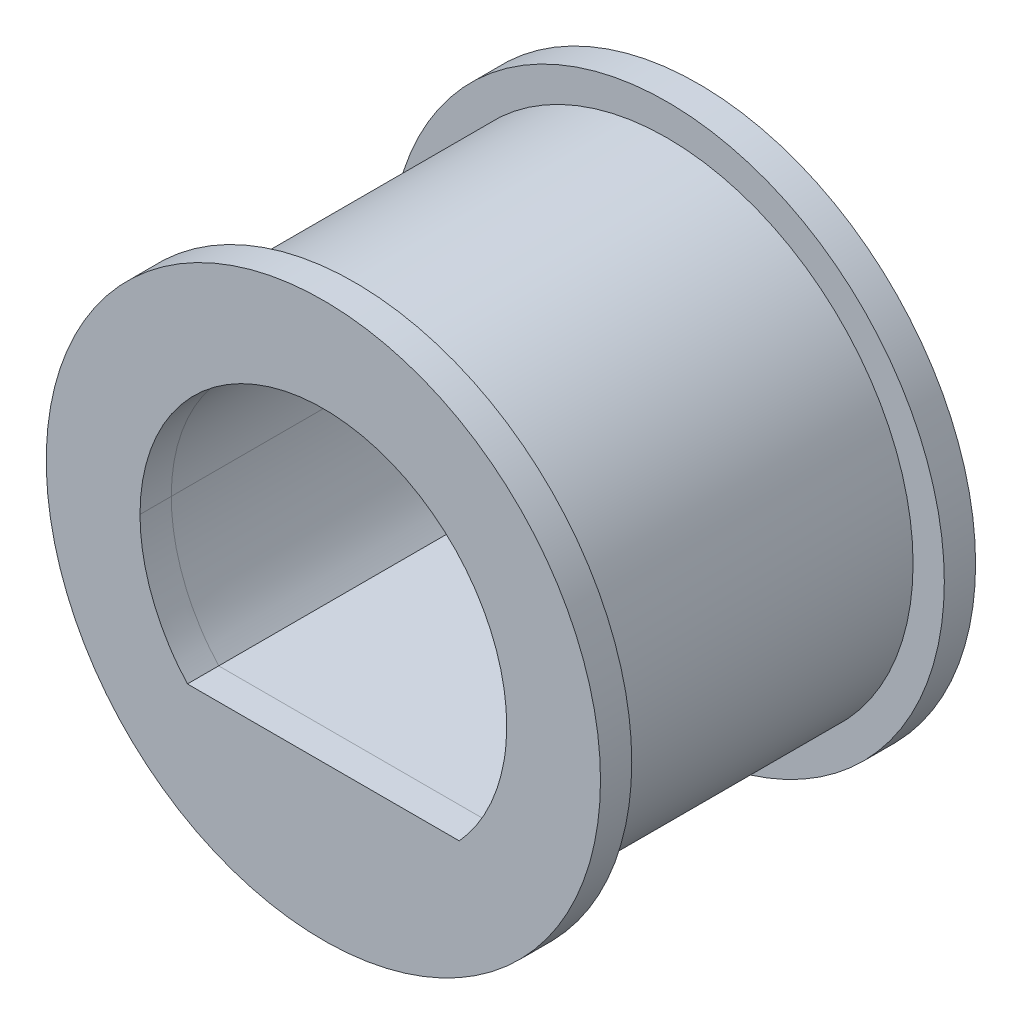
ISO-10303-21;
HEADER;
FILE_DESCRIPTION(('STEP AP214'),'2;1');
FILE_NAME('part.step','',(''),(''),'','','');
FILE_SCHEMA(('AUTOMOTIVE_DESIGN { 1 0 10303 214 1 1 1 1 }'));
ENDSEC;
DATA;
#1=APPLICATION_CONTEXT('core data for automotive mechanical design processes');
#2=APPLICATION_PROTOCOL_DEFINITION('international standard','automotive_design',2000,#1);
#3=PRODUCT_CONTEXT('',#1,'mechanical');
#4=PRODUCT('Part','Part','',(#3));
#5=PRODUCT_RELATED_PRODUCT_CATEGORY('part','',(#4));
#6=PRODUCT_DEFINITION_FORMATION('','',#4);
#7=PRODUCT_DEFINITION_CONTEXT('part definition',#1,'design');
#8=PRODUCT_DEFINITION('design','',#6,#7);
#9=PRODUCT_DEFINITION_SHAPE('','',#8);
#10=(LENGTH_UNIT() NAMED_UNIT(*) SI_UNIT(.MILLI.,.METRE.));
#11=(NAMED_UNIT(*) PLANE_ANGLE_UNIT() SI_UNIT($,.RADIAN.));
#12=(NAMED_UNIT(*) SI_UNIT($,.STERADIAN.) SOLID_ANGLE_UNIT());
#13=UNCERTAINTY_MEASURE_WITH_UNIT(LENGTH_MEASURE(1.E-05),#10,'distance_accuracy_value','');
#14=(GEOMETRIC_REPRESENTATION_CONTEXT(3) GLOBAL_UNCERTAINTY_ASSIGNED_CONTEXT((#13)) GLOBAL_UNIT_ASSIGNED_CONTEXT((#10,
#11,#12)) REPRESENTATION_CONTEXT('',''));
#15=CARTESIAN_POINT('',(0.,0.,0.));
#16=DIRECTION('',(0.,0.,1.));
#17=DIRECTION('',(1.,0.,0.));
#18=AXIS2_PLACEMENT_3D('',#15,#16,#17);
#19=CARTESIAN_POINT('',(-14.5851739919806,6.36139254563578,-1.524));
#20=DIRECTION('',(0.,0.,-1.));
#21=DIRECTION('',(1.,0.,0.));
#22=AXIS2_PLACEMENT_3D('',#19,#20,#21);
#23=PLANE('',#22);
#24=CARTESIAN_POINT('',(-14.5851739919806,6.36139254563578,-1.524));
#25=DIRECTION('',(0.,0.,1.));
#26=DIRECTION('',(1.,0.,0.));
#27=AXIS2_PLACEMENT_3D('',#24,#25,#26);
#28=CIRCLE('',#27,2.25199999921703);
#29=CARTESIAN_POINT('',(-12.3331739927636,6.36139254563578,-1.524));
#30=VERTEX_POINT('',#29);
#31=EDGE_CURVE('E13',#30,#30,#28,.T.);
#32=ORIENTED_EDGE('',*,*,#31,.F.);
#33=EDGE_LOOP('',(#32));
#34=FACE_BOUND('',#33,.T.);
#35=CARTESIAN_POINT('',(-13.4805926232933,5.36139254501032,-1.524));
#36=CARTESIAN_POINT('',(-13.4605394357838,5.38434117095109,-1.524));
#37=CARTESIAN_POINT('',(-13.4204708591206,5.43019516685029,-1.524));
#38=CARTESIAN_POINT('',(-13.3658428414687,5.50351120059409,-1.524));
#39=CARTESIAN_POINT('',(-13.3071543361872,5.59247995033721,-1.524));
#40=CARTESIAN_POINT('',(-13.2480453188042,5.69918428010977,-1.524));
#41=CARTESIAN_POINT('',(-13.1929241765407,5.82478776874763,-1.524));
#42=CARTESIAN_POINT('',(-13.1494392898135,5.95491063640749,-1.524));
#43=CARTESIAN_POINT('',(-13.1184048189158,6.08848749479873,-1.524));
#44=CARTESIAN_POINT('',(-13.0987916792207,6.22435735579674,-1.524));
#45=CARTESIAN_POINT('',(-13.0963798882491,6.3157141490313,-1.524));
#46=CARTESIAN_POINT('',(-13.0951739927636,6.36139254563578,-1.524));
#47=B_SPLINE_CURVE_WITH_KNOTS('',3,(#35,#36,#37,#38,#39,#40,#41,#42,#43,#44,#45,#46),
.UNSPECIFIED.,.F.,.F.,(4,1,1,1,1,1,1,1,1,4),(0.,0.0833979864074417,0.166638775523961,
0.25003676136842,0.375030634223039,0.500024507366998,0.625018380155766,0.750012254396463,
0.875006127233265,1.),.UNSPECIFIED.);
#48=CARTESIAN_POINT('',(-13.4805926232933,5.36139254501032,-1.524));
#49=VERTEX_POINT('',#48);
#50=CARTESIAN_POINT('',(-13.0951739927636,6.36139254563578,-1.524));
#51=VERTEX_POINT('',#50);
#52=EDGE_CURVE('E128',#49,#51,#47,.T.);
#53=ORIENTED_EDGE('',*,*,#52,.T.);
#54=CARTESIAN_POINT('',(-14.5851739919806,6.36139254563578,-1.524));
#55=DIRECTION('',(0.,0.,1.));
#56=DIRECTION('',(1.,0.,0.));
#57=AXIS2_PLACEMENT_3D('',#54,#55,#56);
#58=CIRCLE('',#57,1.48999999921703);
#59=CARTESIAN_POINT('',(-16.0751739911976,6.36139254563578,-1.524));
#60=VERTEX_POINT('',#59);
#61=EDGE_CURVE('E133',#51,#60,#58,.T.);
#62=ORIENTED_EDGE('',*,*,#61,.T.);
#63=CARTESIAN_POINT('',(-16.0751739911976,6.36139254563578,-1.524));
#64=CARTESIAN_POINT('',(-16.0746382538317,6.33092153102337,-1.524));
#65=CARTESIAN_POINT('',(-16.0735677889119,6.27003693665063,-1.524));
#66=CARTESIAN_POINT('',(-16.0648597735471,6.17902247897637,-1.524));
#67=CARTESIAN_POINT('',(-16.0486567402516,6.0736790365428,-1.524));
#68=CARTESIAN_POINT('',(-16.0208623719507,5.95490545737212,-1.524));
#69=CARTESIAN_POINT('',(-15.9774276719287,5.82479779553086,-1.524));
#70=CARTESIAN_POINT('',(-15.9223335293216,5.69914935201207,-1.524));
#71=CARTESIAN_POINT('',(-15.8556914098492,5.57929634493184,-1.524));
#72=CARTESIAN_POINT('',(-15.779043388613,5.46540878983214,-1.524));
#73=CARTESIAN_POINT('',(-15.7195180367,5.39606462667621,-1.524));
#74=CARTESIAN_POINT('',(-15.689755360668,5.36139254501032,-1.524));
#75=B_SPLINE_CURVE_WITH_KNOTS('',3,(#63,#64,#65,#66,#67,#68,#69,#70,#71,#72,#73,#74),
.UNSPECIFIED.,.F.,.F.,(4,1,1,1,1,1,1,1,1,4),(0.,0.083397985699971,0.166638774436386,
0.250036760198587,0.375030634439858,0.5000245072292,0.625018380373733,0.750012253228926,
0.875006126297524,1.),.UNSPECIFIED.);
#76=CARTESIAN_POINT('',(-15.689755360668,5.36139254501032,-1.524));
#77=VERTEX_POINT('',#76);
#78=EDGE_CURVE('E129',#60,#77,#75,.T.);
#79=ORIENTED_EDGE('',*,*,#78,.T.);
#80=DIRECTION('',(1.,0.,0.));
#81=VECTOR('',#80,1.);
#82=CARTESIAN_POINT('',(0.,5.36139254501032,-1.524));
#83=LINE('',#82,#81);
#84=EDGE_CURVE('E115',#77,#49,#83,.T.);
#85=ORIENTED_EDGE('',*,*,#84,.T.);
#86=EDGE_LOOP('',(#53,#62,#79,#85));
#87=FACE_BOUND('',#86,.T.);
#88=ADVANCED_FACE('F72',(#34,#87),#23,.T.);
#89=CARTESIAN_POINT('',(-14.5851739919806,6.36139254563578,-1.27));
#90=DIRECTION('',(0.,0.,-1.));
#91=DIRECTION('',(1.,0.,0.));
#92=AXIS2_PLACEMENT_3D('',#89,#90,#91);
#93=PLANE('',#92);
#94=CARTESIAN_POINT('',(-14.5851739919806,6.36139254563578,-1.27));
#95=DIRECTION('',(0.,0.,1.));
#96=DIRECTION('',(1.,0.,0.));
#97=AXIS2_PLACEMENT_3D('',#94,#95,#96);
#98=CIRCLE('',#97,2.25199999921703);
#99=CARTESIAN_POINT('',(-12.3331739927636,6.36139254563578,-1.27));
#100=VERTEX_POINT('',#99);
#101=EDGE_CURVE('E76',#100,#100,#98,.T.);
#102=ORIENTED_EDGE('',*,*,#101,.T.);
#103=EDGE_LOOP('',(#102));
#104=FACE_BOUND('',#103,.T.);
#105=DIRECTION('',(1.,0.,0.));
#106=VECTOR('',#105,1.);
#107=CARTESIAN_POINT('',(0.,5.36139254501032,-1.27));
#108=LINE('',#107,#106);
#109=CARTESIAN_POINT('',(-15.689755360668,5.36139254501032,-1.27));
#110=VERTEX_POINT('',#109);
#111=CARTESIAN_POINT('',(-13.4805926232933,5.36139254501032,-1.27));
#112=VERTEX_POINT('',#111);
#113=EDGE_CURVE('E118',#110,#112,#108,.T.);
#114=ORIENTED_EDGE('',*,*,#113,.F.);
#115=CARTESIAN_POINT('',(-16.0751739911976,6.36139254563578,-1.27));
#116=CARTESIAN_POINT('',(-16.0746382538317,6.33092153102337,-1.27));
#117=CARTESIAN_POINT('',(-16.0735677889119,6.27003693665063,-1.27));
#118=CARTESIAN_POINT('',(-16.0648597735471,6.17902247897637,-1.27));
#119=CARTESIAN_POINT('',(-16.0486567402516,6.0736790365428,-1.27));
#120=CARTESIAN_POINT('',(-16.0208623719507,5.95490545737212,-1.27));
#121=CARTESIAN_POINT('',(-15.9774276719287,5.82479779553086,-1.27));
#122=CARTESIAN_POINT('',(-15.9223335293216,5.69914935201207,-1.27));
#123=CARTESIAN_POINT('',(-15.8556914098492,5.57929634493184,-1.27));
#124=CARTESIAN_POINT('',(-15.779043388613,5.46540878983214,-1.27));
#125=CARTESIAN_POINT('',(-15.7195180367,5.39606462667621,-1.27));
#126=CARTESIAN_POINT('',(-15.689755360668,5.36139254501032,-1.27));
#127=B_SPLINE_CURVE_WITH_KNOTS('',3,(#115,#116,#117,#118,#119,#120,#121,#122,#123,#124,#125,
#126),.UNSPECIFIED.,.F.,.F.,(4,1,1,1,1,1,1,1,1,4),(0.,0.083397985699971,0.166638774436386,
0.250036760198587,0.375030634439858,0.5000245072292,0.625018380373733,0.750012253228926,
0.875006126297524,1.),.UNSPECIFIED.);
#128=CARTESIAN_POINT('',(-16.0751739911976,6.36139254563578,-1.27));
#129=VERTEX_POINT('',#128);
#130=EDGE_CURVE('E130',#129,#110,#127,.T.);
#131=ORIENTED_EDGE('',*,*,#130,.F.);
#132=CARTESIAN_POINT('',(-14.5851739919806,6.36139254563578,-1.27));
#133=DIRECTION('',(0.,0.,1.));
#134=DIRECTION('',(1.,0.,0.));
#135=AXIS2_PLACEMENT_3D('',#132,#133,#134);
#136=CIRCLE('',#135,1.48999999921703);
#137=CARTESIAN_POINT('',(-13.0951739927636,6.36139254563578,-1.27));
#138=VERTEX_POINT('',#137);
#139=EDGE_CURVE('E167',#138,#129,#136,.T.);
#140=ORIENTED_EDGE('',*,*,#139,.F.);
#141=CARTESIAN_POINT('',(-13.4805926232933,5.36139254501032,-1.27));
#142=CARTESIAN_POINT('',(-13.4605394357838,5.38434117095109,-1.27));
#143=CARTESIAN_POINT('',(-13.4204708591206,5.43019516685029,-1.27));
#144=CARTESIAN_POINT('',(-13.3658428414687,5.50351120059409,-1.27));
#145=CARTESIAN_POINT('',(-13.3071543361872,5.59247995033721,-1.27));
#146=CARTESIAN_POINT('',(-13.2480453188042,5.69918428010977,-1.27));
#147=CARTESIAN_POINT('',(-13.1929241765407,5.82478776874763,-1.27));
#148=CARTESIAN_POINT('',(-13.1494392898135,5.95491063640749,-1.27));
#149=CARTESIAN_POINT('',(-13.1184048189158,6.08848749479873,-1.27));
#150=CARTESIAN_POINT('',(-13.0987916792207,6.22435735579674,-1.27));
#151=CARTESIAN_POINT('',(-13.0963798882491,6.3157141490313,-1.27));
#152=CARTESIAN_POINT('',(-13.0951739927636,6.36139254563578,-1.27));
#153=B_SPLINE_CURVE_WITH_KNOTS('',3,(#141,#142,#143,#144,#145,#146,#147,#148,#149,#150,#151,
#152),.UNSPECIFIED.,.F.,.F.,(4,1,1,1,1,1,1,1,1,4),(0.,0.0833979864074417,0.166638775523961,
0.25003676136842,0.375030634223039,0.500024507366998,0.625018380155766,0.750012254396463,
0.875006127233265,1.),.UNSPECIFIED.);
#154=EDGE_CURVE('E165',#112,#138,#153,.T.);
#155=ORIENTED_EDGE('',*,*,#154,.F.);
#156=EDGE_LOOP('',(#114,#131,#140,#155));
#157=FACE_BOUND('',#156,.T.);
#158=ADVANCED_FACE('F152',(#104,#157),#93,.F.);
#159=CARTESIAN_POINT('',(-14.5851739919806,6.36139254563578,-1.524));
#160=DIRECTION('',(0.,0.,1.));
#161=DIRECTION('',(-1.,0.,0.));
#162=AXIS2_PLACEMENT_3D('',#159,#160,#161);
#163=CYLINDRICAL_SURFACE('',#162,2.25199999921703);
#164=ORIENTED_EDGE('',*,*,#31,.T.);
#165=EDGE_LOOP('',(#164));
#166=FACE_BOUND('',#165,.T.);
#167=ORIENTED_EDGE('',*,*,#101,.F.);
#168=EDGE_LOOP('',(#167));
#169=FACE_BOUND('',#168,.T.);
#170=ADVANCED_FACE('F74',(#166,#169),#163,.T.);
#171=CARTESIAN_POINT('',(0.,5.36139254501032,-1.524));
#172=DIRECTION('',(0.,1.,0.));
#173=DIRECTION('',(0.,0.,-1.));
#174=AXIS2_PLACEMENT_3D('',#171,#172,#173);
#175=PLANE('',#174);
#176=ORIENTED_EDGE('',*,*,#113,.T.);
#177=DIRECTION('',(0.,0.,1.));
#178=VECTOR('',#177,1.);
#179=CARTESIAN_POINT('',(-13.4805926232933,5.36139254501032,-1.524));
#180=LINE('',#179,#178);
#181=EDGE_CURVE('E112',#49,#112,#180,.T.);
#182=ORIENTED_EDGE('',*,*,#181,.F.);
#183=ORIENTED_EDGE('',*,*,#84,.F.);
#184=DIRECTION('',(0.,0.,1.));
#185=VECTOR('',#184,1.);
#186=CARTESIAN_POINT('',(-15.689755360668,5.36139254501032,-1.524));
#187=LINE('',#186,#185);
#188=EDGE_CURVE('E95',#77,#110,#187,.T.);
#189=ORIENTED_EDGE('',*,*,#188,.T.);
#190=EDGE_LOOP('',(#176,#182,#183,#189));
#191=FACE_BOUND('',#190,.T.);
#192=ADVANCED_FACE('F114',(#191),#175,.T.);
#193=DIRECTION('',(0.,0.,1.));
#194=VECTOR('',#193,1.);
#195=SURFACE_OF_LINEAR_EXTRUSION('',#47,#194);
#196=ORIENTED_EDGE('',*,*,#154,.T.);
#197=DIRECTION('',(0.,0.,1.));
#198=VECTOR('',#197,1.);
#199=CARTESIAN_POINT('',(-13.0951739927636,6.36139254563578,-1.524));
#200=LINE('',#199,#198);
#201=EDGE_CURVE('E123',#51,#138,#200,.T.);
#202=ORIENTED_EDGE('',*,*,#201,.F.);
#203=ORIENTED_EDGE('',*,*,#52,.F.);
#204=ORIENTED_EDGE('',*,*,#181,.T.);
#205=EDGE_LOOP('',(#196,#202,#203,#204));
#206=FACE_BOUND('',#205,.T.);
#207=ADVANCED_FACE('F132',(#206),#195,.F.);
#208=CARTESIAN_POINT('',(-14.5851739919806,6.36139254563578,-1.524));
#209=DIRECTION('',(0.,0.,1.));
#210=DIRECTION('',(-1.,0.,0.));
#211=AXIS2_PLACEMENT_3D('',#208,#209,#210);
#212=CYLINDRICAL_SURFACE('',#211,1.48999999921703);
#213=ORIENTED_EDGE('',*,*,#139,.T.);
#214=DIRECTION('',(0.,0.,1.));
#215=VECTOR('',#214,1.);
#216=CARTESIAN_POINT('',(-16.0751739911976,6.36139254563578,-1.524));
#217=LINE('',#216,#215);
#218=EDGE_CURVE('E87',#60,#129,#217,.T.);
#219=ORIENTED_EDGE('',*,*,#218,.F.);
#220=ORIENTED_EDGE('',*,*,#61,.F.);
#221=ORIENTED_EDGE('',*,*,#201,.T.);
#222=EDGE_LOOP('',(#213,#219,#220,#221));
#223=FACE_BOUND('',#222,.T.);
#224=ADVANCED_FACE('F147',(#223),#212,.F.);
#225=DIRECTION('',(0.,0.,1.));
#226=VECTOR('',#225,1.);
#227=SURFACE_OF_LINEAR_EXTRUSION('',#75,#226);
#228=ORIENTED_EDGE('',*,*,#130,.T.);
#229=ORIENTED_EDGE('',*,*,#188,.F.);
#230=ORIENTED_EDGE('',*,*,#78,.F.);
#231=ORIENTED_EDGE('',*,*,#218,.T.);
#232=EDGE_LOOP('',(#228,#229,#230,#231));
#233=FACE_BOUND('',#232,.T.);
#234=ADVANCED_FACE('F188',(#233),#227,.F.);
#235=CLOSED_SHELL('',(#88,#158,#170,#192,#207,#224,#234));
#236=MANIFOLD_SOLID_BREP('B2',#235);
#237=CARTESIAN_POINT('',(-14.5851739919806,6.36139254563578,1.524));
#238=DIRECTION('',(0.,0.,1.));
#239=DIRECTION('',(1.,0.,0.));
#240=AXIS2_PLACEMENT_3D('',#237,#238,#239);
#241=PLANE('',#240);
#242=CARTESIAN_POINT('',(-14.5851739919806,6.36139254563578,1.524));
#243=DIRECTION('',(0.,0.,1.));
#244=DIRECTION('',(1.,0.,0.));
#245=AXIS2_PLACEMENT_3D('',#242,#243,#244);
#246=CIRCLE('',#245,2.25199999921703);
#247=CARTESIAN_POINT('',(-12.3331739927636,6.36139254563578,1.524));
#248=VERTEX_POINT('',#247);
#249=EDGE_CURVE('E70',#248,#248,#246,.T.);
#250=ORIENTED_EDGE('',*,*,#249,.T.);
#251=EDGE_LOOP('',(#250));
#252=FACE_BOUND('',#251,.T.);
#253=CARTESIAN_POINT('',(-13.4805926232933,5.36139254501032,1.524));
#254=CARTESIAN_POINT('',(-13.4605394357838,5.38434117095109,1.524));
#255=CARTESIAN_POINT('',(-13.4204708591206,5.43019516685029,1.524));
#256=CARTESIAN_POINT('',(-13.3658428414687,5.50351120059409,1.524));
#257=CARTESIAN_POINT('',(-13.3071543361872,5.59247995033721,1.524));
#258=CARTESIAN_POINT('',(-13.2480453188042,5.69918428010977,1.524));
#259=CARTESIAN_POINT('',(-13.1929241765407,5.82478776874763,1.524));
#260=CARTESIAN_POINT('',(-13.1494392898135,5.95491063640749,1.524));
#261=CARTESIAN_POINT('',(-13.1184048189158,6.08848749479873,1.524));
#262=CARTESIAN_POINT('',(-13.0987916792207,6.22435735579674,1.524));
#263=CARTESIAN_POINT('',(-13.0963798882491,6.3157141490313,1.524));
#264=CARTESIAN_POINT('',(-13.0951739927636,6.36139254563578,1.524));
#265=B_SPLINE_CURVE_WITH_KNOTS('',3,(#253,#254,#255,#256,#257,#258,#259,#260,#261,#262,#263,
#264),.UNSPECIFIED.,.F.,.F.,(4,1,1,1,1,1,1,1,1,4),(0.,0.0833979864074417,0.166638775523961,
0.25003676136842,0.375030634223039,0.500024507366998,0.625018380155766,0.750012254396463,
0.875006127233265,1.),.UNSPECIFIED.);
#266=CARTESIAN_POINT('',(-13.4805926232933,5.36139254501032,1.524));
#267=VERTEX_POINT('',#266);
#268=CARTESIAN_POINT('',(-13.0951739927636,6.36139254563578,1.524));
#269=VERTEX_POINT('',#268);
#270=EDGE_CURVE('E302',#267,#269,#265,.T.);
#271=ORIENTED_EDGE('',*,*,#270,.F.);
#272=DIRECTION('',(1.,0.,0.));
#273=VECTOR('',#272,1.);
#274=CARTESIAN_POINT('',(0.,5.36139254501032,1.524));
#275=LINE('',#274,#273);
#276=CARTESIAN_POINT('',(-15.689755360668,5.36139254501032,1.524));
#277=VERTEX_POINT('',#276);
#278=EDGE_CURVE('E294',#277,#267,#275,.T.);
#279=ORIENTED_EDGE('',*,*,#278,.F.);
#280=CARTESIAN_POINT('',(-16.0751739911976,6.36139254563578,1.524));
#281=CARTESIAN_POINT('',(-16.0746382538317,6.33092153102337,1.524));
#282=CARTESIAN_POINT('',(-16.0735677889119,6.27003693665063,1.524));
#283=CARTESIAN_POINT('',(-16.0648597735471,6.17902247897637,1.524));
#284=CARTESIAN_POINT('',(-16.0486567402516,6.0736790365428,1.524));
#285=CARTESIAN_POINT('',(-16.0208623719507,5.95490545737212,1.524));
#286=CARTESIAN_POINT('',(-15.9774276719287,5.82479779553086,1.524));
#287=CARTESIAN_POINT('',(-15.9223335293216,5.69914935201207,1.524));
#288=CARTESIAN_POINT('',(-15.8556914098492,5.57929634493184,1.524));
#289=CARTESIAN_POINT('',(-15.779043388613,5.46540878983214,1.524));
#290=CARTESIAN_POINT('',(-15.7195180367,5.39606462667621,1.524));
#291=CARTESIAN_POINT('',(-15.689755360668,5.36139254501032,1.524));
#292=B_SPLINE_CURVE_WITH_KNOTS('',3,(#280,#281,#282,#283,#284,#285,#286,#287,#288,#289,#290,
#291),.UNSPECIFIED.,.F.,.F.,(4,1,1,1,1,1,1,1,1,4),(0.,0.083397985699971,0.166638774436386,
0.250036760198587,0.375030634439858,0.5000245072292,0.625018380373733,0.750012253228926,
0.875006126297524,1.),.UNSPECIFIED.);
#293=CARTESIAN_POINT('',(-16.0751739911976,6.36139254563578,1.524));
#294=VERTEX_POINT('',#293);
#295=EDGE_CURVE('E315',#294,#277,#292,.T.);
#296=ORIENTED_EDGE('',*,*,#295,.F.);
#297=CARTESIAN_POINT('',(-14.5851739919806,6.36139254563578,1.524));
#298=DIRECTION('',(0.,0.,1.));
#299=DIRECTION('',(1.,0.,0.));
#300=AXIS2_PLACEMENT_3D('',#297,#298,#299);
#301=CIRCLE('',#300,1.48999999921703);
#302=EDGE_CURVE('E313',#269,#294,#301,.T.);
#303=ORIENTED_EDGE('',*,*,#302,.F.);
#304=EDGE_LOOP('',(#271,#279,#296,#303));
#305=FACE_BOUND('',#304,.T.);
#306=ADVANCED_FACE('F253',(#252,#305),#241,.T.);
#307=CARTESIAN_POINT('',(-14.5851739919806,6.36139254563578,1.27));
#308=DIRECTION('',(0.,0.,1.));
#309=DIRECTION('',(1.,0.,0.));
#310=AXIS2_PLACEMENT_3D('',#307,#308,#309);
#311=PLANE('',#310);
#312=CARTESIAN_POINT('',(-14.5851739919806,6.36139254563578,1.27));
#313=DIRECTION('',(0.,0.,1.));
#314=DIRECTION('',(1.,0.,0.));
#315=AXIS2_PLACEMENT_3D('',#312,#313,#314);
#316=CIRCLE('',#315,2.25199999921703);
#317=CARTESIAN_POINT('',(-12.3331739927636,6.36139254563578,1.27));
#318=VERTEX_POINT('',#317);
#319=EDGE_CURVE('E257',#318,#318,#316,.T.);
#320=ORIENTED_EDGE('',*,*,#319,.F.);
#321=EDGE_LOOP('',(#320));
#322=FACE_BOUND('',#321,.T.);
#323=DIRECTION('',(1.,0.,0.));
#324=VECTOR('',#323,1.);
#325=CARTESIAN_POINT('',(0.,5.36139254501032,1.27));
#326=LINE('',#325,#324);
#327=CARTESIAN_POINT('',(-15.689755360668,5.36139254501032,1.27));
#328=VERTEX_POINT('',#327);
#329=CARTESIAN_POINT('',(-13.4805926232933,5.36139254501032,1.27));
#330=VERTEX_POINT('',#329);
#331=EDGE_CURVE('E276',#328,#330,#326,.T.);
#332=ORIENTED_EDGE('',*,*,#331,.T.);
#333=CARTESIAN_POINT('',(-13.4805926232933,5.36139254501032,1.27));
#334=CARTESIAN_POINT('',(-13.4605394357838,5.38434117095109,1.27));
#335=CARTESIAN_POINT('',(-13.4204708591206,5.43019516685029,1.27));
#336=CARTESIAN_POINT('',(-13.3658428414687,5.50351120059409,1.27));
#337=CARTESIAN_POINT('',(-13.3071543361872,5.59247995033721,1.27));
#338=CARTESIAN_POINT('',(-13.2480453188042,5.69918428010977,1.27));
#339=CARTESIAN_POINT('',(-13.1929241765407,5.82478776874763,1.27));
#340=CARTESIAN_POINT('',(-13.1494392898135,5.95491063640749,1.27));
#341=CARTESIAN_POINT('',(-13.1184048189158,6.08848749479873,1.27));
#342=CARTESIAN_POINT('',(-13.0987916792207,6.22435735579674,1.27));
#343=CARTESIAN_POINT('',(-13.0963798882491,6.3157141490313,1.27));
#344=CARTESIAN_POINT('',(-13.0951739927636,6.36139254563578,1.27));
#345=B_SPLINE_CURVE_WITH_KNOTS('',3,(#333,#334,#335,#336,#337,#338,#339,#340,#341,#342,#343,
#344),.UNSPECIFIED.,.F.,.F.,(4,1,1,1,1,1,1,1,1,4),(0.,0.0833979864074417,0.166638775523961,
0.25003676136842,0.375030634223039,0.500024507366998,0.625018380155766,0.750012254396463,
0.875006127233265,1.),.UNSPECIFIED.);
#346=CARTESIAN_POINT('',(-13.0951739927636,6.36139254563578,1.27));
#347=VERTEX_POINT('',#346);
#348=EDGE_CURVE('E309',#330,#347,#345,.T.);
#349=ORIENTED_EDGE('',*,*,#348,.T.);
#350=CARTESIAN_POINT('',(-14.5851739919806,6.36139254563578,1.27));
#351=DIRECTION('',(0.,0.,1.));
#352=DIRECTION('',(1.,0.,0.));
#353=AXIS2_PLACEMENT_3D('',#350,#351,#352);
#354=CIRCLE('',#353,1.48999999921703);
#355=CARTESIAN_POINT('',(-16.0751739911976,6.36139254563578,1.27));
#356=VERTEX_POINT('',#355);
#357=EDGE_CURVE('E347',#347,#356,#354,.T.);
#358=ORIENTED_EDGE('',*,*,#357,.T.);
#359=CARTESIAN_POINT('',(-16.0751739911976,6.36139254563578,1.27));
#360=CARTESIAN_POINT('',(-16.0746382538317,6.33092153102337,1.27));
#361=CARTESIAN_POINT('',(-16.0735677889119,6.27003693665063,1.27));
#362=CARTESIAN_POINT('',(-16.0648597735471,6.17902247897637,1.27));
#363=CARTESIAN_POINT('',(-16.0486567402516,6.0736790365428,1.27));
#364=CARTESIAN_POINT('',(-16.0208623719507,5.95490545737212,1.27));
#365=CARTESIAN_POINT('',(-15.9774276719287,5.82479779553086,1.27));
#366=CARTESIAN_POINT('',(-15.9223335293216,5.69914935201207,1.27));
#367=CARTESIAN_POINT('',(-15.8556914098492,5.57929634493184,1.27));
#368=CARTESIAN_POINT('',(-15.779043388613,5.46540878983214,1.27));
#369=CARTESIAN_POINT('',(-15.7195180367,5.39606462667621,1.27));
#370=CARTESIAN_POINT('',(-15.689755360668,5.36139254501032,1.27));
#371=B_SPLINE_CURVE_WITH_KNOTS('',3,(#359,#360,#361,#362,#363,#364,#365,#366,#367,#368,#369,
#370),.UNSPECIFIED.,.F.,.F.,(4,1,1,1,1,1,1,1,1,4),(0.,0.083397985699971,0.166638774436386,
0.250036760198587,0.375030634439858,0.5000245072292,0.625018380373733,0.750012253228926,
0.875006126297524,1.),.UNSPECIFIED.);
#372=EDGE_CURVE('E303',#356,#328,#371,.T.);
#373=ORIENTED_EDGE('',*,*,#372,.T.);
#374=EDGE_LOOP('',(#332,#349,#358,#373));
#375=FACE_BOUND('',#374,.T.);
#376=ADVANCED_FACE('F333',(#322,#375),#311,.F.);
#377=CARTESIAN_POINT('',(-14.5851739919806,6.36139254563578,1.524));
#378=DIRECTION('',(0.,0.,-1.));
#379=DIRECTION('',(-1.,0.,0.));
#380=AXIS2_PLACEMENT_3D('',#377,#378,#379);
#381=CYLINDRICAL_SURFACE('',#380,2.25199999921703);
#382=ORIENTED_EDGE('',*,*,#249,.F.);
#383=EDGE_LOOP('',(#382));
#384=FACE_BOUND('',#383,.T.);
#385=ORIENTED_EDGE('',*,*,#319,.T.);
#386=EDGE_LOOP('',(#385));
#387=FACE_BOUND('',#386,.T.);
#388=ADVANCED_FACE('F255',(#384,#387),#381,.T.);
#389=CARTESIAN_POINT('',(0.,5.36139254501032,1.524));
#390=DIRECTION('',(0.,1.,0.));
#391=DIRECTION('',(0.,0.,1.));
#392=AXIS2_PLACEMENT_3D('',#389,#390,#391);
#393=PLANE('',#392);
#394=ORIENTED_EDGE('',*,*,#331,.F.);
#395=DIRECTION('',(0.,0.,-1.));
#396=VECTOR('',#395,1.);
#397=CARTESIAN_POINT('',(-15.689755360668,5.36139254501032,1.524));
#398=LINE('',#397,#396);
#399=EDGE_CURVE('E298',#277,#328,#398,.T.);
#400=ORIENTED_EDGE('',*,*,#399,.F.);
#401=ORIENTED_EDGE('',*,*,#278,.T.);
#402=DIRECTION('',(0.,0.,-1.));
#403=VECTOR('',#402,1.);
#404=CARTESIAN_POINT('',(-13.4805926232933,5.36139254501032,1.524));
#405=LINE('',#404,#403);
#406=EDGE_CURVE('E297',#267,#330,#405,.T.);
#407=ORIENTED_EDGE('',*,*,#406,.T.);
#408=EDGE_LOOP('',(#394,#400,#401,#407));
#409=FACE_BOUND('',#408,.T.);
#410=ADVANCED_FACE('F296',(#409),#393,.T.);
#411=DIRECTION('',(0.,0.,-1.));
#412=VECTOR('',#411,1.);
#413=SURFACE_OF_LINEAR_EXTRUSION('',#265,#412);
#414=ORIENTED_EDGE('',*,*,#348,.F.);
#415=ORIENTED_EDGE('',*,*,#406,.F.);
#416=ORIENTED_EDGE('',*,*,#270,.T.);
#417=DIRECTION('',(0.,0.,-1.));
#418=VECTOR('',#417,1.);
#419=CARTESIAN_POINT('',(-13.0951739927636,6.36139254563578,1.524));
#420=LINE('',#419,#418);
#421=EDGE_CURVE('E310',#269,#347,#420,.T.);
#422=ORIENTED_EDGE('',*,*,#421,.T.);
#423=EDGE_LOOP('',(#414,#415,#416,#422));
#424=FACE_BOUND('',#423,.T.);
#425=ADVANCED_FACE('F306',(#424),#413,.T.);
#426=CARTESIAN_POINT('',(-14.5851739919806,6.36139254563578,1.524));
#427=DIRECTION('',(0.,0.,-1.));
#428=DIRECTION('',(-1.,0.,0.));
#429=AXIS2_PLACEMENT_3D('',#426,#427,#428);
#430=CYLINDRICAL_SURFACE('',#429,1.48999999921703);
#431=ORIENTED_EDGE('',*,*,#357,.F.);
#432=ORIENTED_EDGE('',*,*,#421,.F.);
#433=ORIENTED_EDGE('',*,*,#302,.T.);
#434=DIRECTION('',(0.,0.,-1.));
#435=VECTOR('',#434,1.);
#436=CARTESIAN_POINT('',(-16.0751739911976,6.36139254563578,1.524));
#437=LINE('',#436,#435);
#438=EDGE_CURVE('E268',#294,#356,#437,.T.);
#439=ORIENTED_EDGE('',*,*,#438,.T.);
#440=EDGE_LOOP('',(#431,#432,#433,#439));
#441=FACE_BOUND('',#440,.T.);
#442=ADVANCED_FACE('F328',(#441),#430,.F.);
#443=DIRECTION('',(0.,0.,-1.));
#444=VECTOR('',#443,1.);
#445=SURFACE_OF_LINEAR_EXTRUSION('',#292,#444);
#446=ORIENTED_EDGE('',*,*,#372,.F.);
#447=ORIENTED_EDGE('',*,*,#438,.F.);
#448=ORIENTED_EDGE('',*,*,#295,.T.);
#449=ORIENTED_EDGE('',*,*,#399,.T.);
#450=EDGE_LOOP('',(#446,#447,#448,#449));
#451=FACE_BOUND('',#450,.T.);
#452=ADVANCED_FACE('F369',(#451),#445,.T.);
#453=CLOSED_SHELL('',(#306,#376,#388,#410,#425,#442,#452));
#454=MANIFOLD_SOLID_BREP('B7',#453);
#455=CARTESIAN_POINT('',(-13.4805926232933,5.36139254501032,1.27));
#456=CARTESIAN_POINT('',(-13.4605394357838,5.38434117095109,1.27));
#457=CARTESIAN_POINT('',(-13.4204708591206,5.43019516685029,1.27));
#458=CARTESIAN_POINT('',(-13.3658428414687,5.50351120059409,1.27));
#459=CARTESIAN_POINT('',(-13.3071543361872,5.59247995033721,1.27));
#460=CARTESIAN_POINT('',(-13.2480453188042,5.69918428010977,1.27));
#461=CARTESIAN_POINT('',(-13.1929241765407,5.82478776874763,1.27));
#462=CARTESIAN_POINT('',(-13.1494392898135,5.95491063640749,1.27));
#463=CARTESIAN_POINT('',(-13.1184048189158,6.08848749479873,1.27));
#464=CARTESIAN_POINT('',(-13.0987916792207,6.22435735579674,1.27));
#465=CARTESIAN_POINT('',(-13.0963798882491,6.3157141490313,1.27));
#466=CARTESIAN_POINT('',(-13.0951739927636,6.36139254563578,1.27));
#467=B_SPLINE_CURVE_WITH_KNOTS('',3,(#455,#456,#457,#458,#459,#460,#461,#462,#463,#464,#465,
#466),.UNSPECIFIED.,.F.,.F.,(4,1,1,1,1,1,1,1,1,4),(0.,0.0833979864074417,0.166638775523961,
0.25003676136842,0.375030634223039,0.500024507366998,0.625018380155766,0.750012254396463,
0.875006127233265,1.),.UNSPECIFIED.);
#468=DIRECTION('',(0.,0.,-1.));
#469=VECTOR('',#468,1.);
#470=SURFACE_OF_LINEAR_EXTRUSION('',#467,#469);
#471=CARTESIAN_POINT('',(-13.0951739927636,6.36139254563578,-1.27));
#472=CARTESIAN_POINT('',(-13.0963798882491,6.3157141490313,-1.27));
#473=CARTESIAN_POINT('',(-13.0987916792207,6.22435735579674,-1.27));
#474=CARTESIAN_POINT('',(-13.1184048189158,6.08848749479873,-1.27));
#475=CARTESIAN_POINT('',(-13.1494392898135,5.95491063640749,-1.27));
#476=CARTESIAN_POINT('',(-13.1929241765407,5.82478776874763,-1.27));
#477=CARTESIAN_POINT('',(-13.2480453188042,5.69918428010977,-1.27));
#478=CARTESIAN_POINT('',(-13.3071543361872,5.59247995033721,-1.27));
#479=CARTESIAN_POINT('',(-13.3658428414687,5.50351120059409,-1.27));
#480=CARTESIAN_POINT('',(-13.4204708591206,5.43019516685029,-1.27));
#481=CARTESIAN_POINT('',(-13.4605394357838,5.38434117095109,-1.27));
#482=CARTESIAN_POINT('',(-13.4805926232933,5.36139254501032,-1.27));
#483=B_SPLINE_CURVE_WITH_KNOTS('',3,(#471,#472,#473,#474,#475,#476,#477,#478,#479,#480,#481,
#482),.UNSPECIFIED.,.F.,.F.,(4,1,1,1,1,1,1,1,1,4),(0.,0.124993872766735,0.249987745603537,
0.374981619844234,0.499975492633002,0.624969365776961,0.74996323863158,0.833361224476039,
0.916602013592558,1.),.UNSPECIFIED.);
#484=CARTESIAN_POINT('',(-13.4805926232933,5.36139254501032,-1.27));
#485=VERTEX_POINT('',#484);
#486=CARTESIAN_POINT('',(-13.0951739927636,6.36139254563578,-1.27));
#487=VERTEX_POINT('',#486);
#488=EDGE_CURVE('E569',#485,#487,#483,.F.);
#489=ORIENTED_EDGE('',*,*,#488,.F.);
#490=DIRECTION('',(0.,0.,-1.));
#491=VECTOR('',#490,1.);
#492=CARTESIAN_POINT('',(-13.4805926232933,5.36139254501032,1.27));
#493=LINE('',#492,#491);
#494=CARTESIAN_POINT('',(-13.4805926232933,5.36139254501032,1.27));
#495=VERTEX_POINT('',#494);
#496=EDGE_CURVE('E251',#495,#485,#493,.T.);
#497=ORIENTED_EDGE('',*,*,#496,.F.);
#498=CARTESIAN_POINT('',(-13.4805926232933,5.36139254501032,1.27));
#499=CARTESIAN_POINT('',(-13.4605394357838,5.38434117095109,1.27));
#500=CARTESIAN_POINT('',(-13.4204708591206,5.43019516685029,1.27));
#501=CARTESIAN_POINT('',(-13.3658428414687,5.50351120059409,1.27));
#502=CARTESIAN_POINT('',(-13.3071543361872,5.59247995033721,1.27));
#503=CARTESIAN_POINT('',(-13.2480453188042,5.69918428010977,1.27));
#504=CARTESIAN_POINT('',(-13.1929241765407,5.82478776874763,1.27));
#505=CARTESIAN_POINT('',(-13.1494392898135,5.95491063640749,1.27));
#506=CARTESIAN_POINT('',(-13.1184048189158,6.08848749479873,1.27));
#507=CARTESIAN_POINT('',(-13.0987916792207,6.22435735579674,1.27));
#508=CARTESIAN_POINT('',(-13.0963798882491,6.3157141490313,1.27));
#509=CARTESIAN_POINT('',(-13.0951739927636,6.36139254563578,1.27));
#510=B_SPLINE_CURVE_WITH_KNOTS('',3,(#498,#499,#500,#501,#502,#503,#504,#505,#506,#507,#508,
#509),.UNSPECIFIED.,.F.,.F.,(4,1,1,1,1,1,1,1,1,4),(0.,0.0833979864074417,0.166638775523961,
0.25003676136842,0.375030634223039,0.500024507366998,0.625018380155766,0.750012254396463,
0.875006127233265,1.),.UNSPECIFIED.);
#511=CARTESIAN_POINT('',(-13.0951739927636,6.36139254563578,1.27));
#512=VERTEX_POINT('',#511);
#513=EDGE_CURVE('E480',#495,#512,#510,.T.);
#514=ORIENTED_EDGE('',*,*,#513,.T.);
#515=DIRECTION('',(0.,0.,-1.));
#516=VECTOR('',#515,1.);
#517=CARTESIAN_POINT('',(-13.0951739927636,6.36139254563578,1.27));
#518=LINE('',#517,#516);
#519=EDGE_CURVE('E446',#512,#487,#518,.T.);
#520=ORIENTED_EDGE('',*,*,#519,.T.);
#521=EDGE_LOOP('',(#489,#497,#514,#520));
#522=FACE_BOUND('',#521,.T.);
#523=ADVANCED_FACE('F425',(#522),#470,.T.);
#524=CARTESIAN_POINT('',(0.,5.36139254501032,1.27));
#525=DIRECTION('',(0.,-1.,0.));
#526=DIRECTION('',(0.,0.,-1.));
#527=AXIS2_PLACEMENT_3D('',#524,#525,#526);
#528=PLANE('',#527);
#529=DIRECTION('',(-1.,0.,0.));
#530=VECTOR('',#529,1.);
#531=CARTESIAN_POINT('',(0.,5.36139254501032,-1.27));
#532=LINE('',#531,#530);
#533=CARTESIAN_POINT('',(-15.689755360668,5.36139254501032,-1.27));
#534=VERTEX_POINT('',#533);
#535=EDGE_CURVE('E487',#485,#534,#532,.T.);
#536=ORIENTED_EDGE('',*,*,#535,.T.);
#537=DIRECTION('',(0.,0.,-1.));
#538=VECTOR('',#537,1.);
#539=CARTESIAN_POINT('',(-15.689755360668,5.36139254501032,1.27));
#540=LINE('',#539,#538);
#541=CARTESIAN_POINT('',(-15.689755360668,5.36139254501032,1.27));
#542=VERTEX_POINT('',#541);
#543=EDGE_CURVE('E437',#542,#534,#540,.T.);
#544=ORIENTED_EDGE('',*,*,#543,.F.);
#545=DIRECTION('',(-1.,0.,0.));
#546=VECTOR('',#545,1.);
#547=CARTESIAN_POINT('',(0.,5.36139254501032,1.27));
#548=LINE('',#547,#546);
#549=EDGE_CURVE('E472',#495,#542,#548,.T.);
#550=ORIENTED_EDGE('',*,*,#549,.F.);
#551=ORIENTED_EDGE('',*,*,#496,.T.);
#552=EDGE_LOOP('',(#536,#544,#550,#551));
#553=FACE_BOUND('',#552,.T.);
#554=ADVANCED_FACE('F485',(#553),#528,.F.);
#555=CARTESIAN_POINT('',(-16.0751739911976,6.36139254563578,1.27));
#556=CARTESIAN_POINT('',(-16.0746382538317,6.33092153102337,1.27));
#557=CARTESIAN_POINT('',(-16.0735677889119,6.27003693665063,1.27));
#558=CARTESIAN_POINT('',(-16.0648597735471,6.17902247897637,1.27));
#559=CARTESIAN_POINT('',(-16.0486567402516,6.0736790365428,1.27));
#560=CARTESIAN_POINT('',(-16.0208623719507,5.95490545737212,1.27));
#561=CARTESIAN_POINT('',(-15.9774276719287,5.82479779553086,1.27));
#562=CARTESIAN_POINT('',(-15.9223335293216,5.69914935201207,1.27));
#563=CARTESIAN_POINT('',(-15.8556914098492,5.57929634493184,1.27));
#564=CARTESIAN_POINT('',(-15.779043388613,5.46540878983214,1.27));
#565=CARTESIAN_POINT('',(-15.7195180367,5.39606462667621,1.27));
#566=CARTESIAN_POINT('',(-15.689755360668,5.36139254501032,1.27));
#567=B_SPLINE_CURVE_WITH_KNOTS('',3,(#555,#556,#557,#558,#559,#560,#561,#562,#563,#564,#565,
#566),.UNSPECIFIED.,.F.,.F.,(4,1,1,1,1,1,1,1,1,4),(0.,0.083397985699971,0.166638774436386,
0.250036760198587,0.375030634439858,0.5000245072292,0.625018380373733,0.750012253228926,
0.875006126297524,1.),.UNSPECIFIED.);
#568=DIRECTION('',(0.,0.,-1.));
#569=VECTOR('',#568,1.);
#570=SURFACE_OF_LINEAR_EXTRUSION('',#567,#569);
#571=CARTESIAN_POINT('',(-15.689755360668,5.36139254501032,-1.27));
#572=CARTESIAN_POINT('',(-15.7195180367,5.39606462667621,-1.27));
#573=CARTESIAN_POINT('',(-15.779043388613,5.46540878983214,-1.27));
#574=CARTESIAN_POINT('',(-15.8556914098492,5.57929634493184,-1.27));
#575=CARTESIAN_POINT('',(-15.9223335293216,5.69914935201207,-1.27));
#576=CARTESIAN_POINT('',(-15.9774276719287,5.82479779553086,-1.27));
#577=CARTESIAN_POINT('',(-16.0208623719507,5.95490545737212,-1.27));
#578=CARTESIAN_POINT('',(-16.0486567402516,6.0736790365428,-1.27));
#579=CARTESIAN_POINT('',(-16.0648597735471,6.17902247897637,-1.27));
#580=CARTESIAN_POINT('',(-16.0735677889119,6.27003693665063,-1.27));
#581=CARTESIAN_POINT('',(-16.0746382538317,6.33092153102337,-1.27));
#582=CARTESIAN_POINT('',(-16.0751739911976,6.36139254563578,-1.27));
#583=B_SPLINE_CURVE_WITH_KNOTS('',3,(#571,#572,#573,#574,#575,#576,#577,#578,#579,#580,#581,
#582),.UNSPECIFIED.,.F.,.F.,(4,1,1,1,1,1,1,1,1,4),(0.,0.124993873702476,0.249987746771074,
0.374981619626267,0.4999754927708,0.624969365560142,0.749963239801413,0.833361225563614,
0.916602014300029,1.),.UNSPECIFIED.);
#584=CARTESIAN_POINT('',(-16.0751739911976,6.36139254563578,-1.27));
#585=VERTEX_POINT('',#584);
#586=EDGE_CURVE('E541',#585,#534,#583,.F.);
#587=ORIENTED_EDGE('',*,*,#586,.F.);
#588=DIRECTION('',(0.,0.,-1.));
#589=VECTOR('',#588,1.);
#590=CARTESIAN_POINT('',(-16.0751739911976,6.36139254563578,1.27));
#591=LINE('',#590,#589);
#592=CARTESIAN_POINT('',(-16.0751739911976,6.36139254563578,1.27));
#593=VERTEX_POINT('',#592);
#594=EDGE_CURVE('E459',#593,#585,#591,.T.);
#595=ORIENTED_EDGE('',*,*,#594,.F.);
#596=CARTESIAN_POINT('',(-16.0751739911976,6.36139254563578,1.27));
#597=CARTESIAN_POINT('',(-16.0746382538317,6.33092153102337,1.27));
#598=CARTESIAN_POINT('',(-16.0735677889119,6.27003693665063,1.27));
#599=CARTESIAN_POINT('',(-16.0648597735471,6.17902247897637,1.27));
#600=CARTESIAN_POINT('',(-16.0486567402516,6.0736790365428,1.27));
#601=CARTESIAN_POINT('',(-16.0208623719507,5.95490545737212,1.27));
#602=CARTESIAN_POINT('',(-15.9774276719287,5.82479779553086,1.27));
#603=CARTESIAN_POINT('',(-15.9223335293216,5.69914935201207,1.27));
#604=CARTESIAN_POINT('',(-15.8556914098492,5.57929634493184,1.27));
#605=CARTESIAN_POINT('',(-15.779043388613,5.46540878983214,1.27));
#606=CARTESIAN_POINT('',(-15.7195180367,5.39606462667621,1.27));
#607=CARTESIAN_POINT('',(-15.689755360668,5.36139254501032,1.27));
#608=B_SPLINE_CURVE_WITH_KNOTS('',3,(#596,#597,#598,#599,#600,#601,#602,#603,#604,#605,#606,
#607),.UNSPECIFIED.,.F.,.F.,(4,1,1,1,1,1,1,1,1,4),(0.,0.083397985699971,0.166638774436386,
0.250036760198587,0.375030634439858,0.5000245072292,0.625018380373733,0.750012253228926,
0.875006126297524,1.),.UNSPECIFIED.);
#609=EDGE_CURVE('E478',#593,#542,#608,.T.);
#610=ORIENTED_EDGE('',*,*,#609,.T.);
#611=ORIENTED_EDGE('',*,*,#543,.T.);
#612=EDGE_LOOP('',(#587,#595,#610,#611));
#613=FACE_BOUND('',#612,.T.);
#614=ADVANCED_FACE('F492',(#613),#570,.T.);
#615=CARTESIAN_POINT('',(-14.5851739919806,6.36139254563578,1.27));
#616=DIRECTION('',(0.,0.,-1.));
#617=DIRECTION('',(-1.,0.,0.));
#618=AXIS2_PLACEMENT_3D('',#615,#616,#617);
#619=CYLINDRICAL_SURFACE('',#618,1.48999999921703);
#620=CARTESIAN_POINT('',(-14.5851739919806,6.36139254563578,-1.27));
#621=DIRECTION('',(0.,0.,1.));
#622=DIRECTION('',(1.,0.,0.));
#623=AXIS2_PLACEMENT_3D('',#620,#621,#622);
#624=CIRCLE('',#623,1.48999999921703);
#625=EDGE_CURVE('E571',#487,#585,#624,.T.);
#626=ORIENTED_EDGE('',*,*,#625,.F.);
#627=ORIENTED_EDGE('',*,*,#519,.F.);
#628=CARTESIAN_POINT('',(-14.5851739919806,6.36139254563578,1.27));
#629=DIRECTION('',(0.,0.,1.));
#630=DIRECTION('',(1.,0.,0.));
#631=AXIS2_PLACEMENT_3D('',#628,#629,#630);
#632=CIRCLE('',#631,1.48999999921703);
#633=EDGE_CURVE('E493',#512,#593,#632,.T.);
#634=ORIENTED_EDGE('',*,*,#633,.T.);
#635=ORIENTED_EDGE('',*,*,#594,.T.);
#636=EDGE_LOOP('',(#626,#627,#634,#635));
#637=FACE_BOUND('',#636,.T.);
#638=ADVANCED_FACE('F511',(#637),#619,.F.);
#639=CARTESIAN_POINT('',(-14.5851739919806,6.36139254563578,1.27));
#640=DIRECTION('',(0.,0.,-1.));
#641=DIRECTION('',(-1.,0.,0.));
#642=AXIS2_PLACEMENT_3D('',#639,#640,#641);
#643=CYLINDRICAL_SURFACE('',#642,1.99799999921703);
#644=CARTESIAN_POINT('',(-14.5851739919806,6.36139254563578,1.27));
#645=DIRECTION('',(0.,0.,1.));
#646=DIRECTION('',(1.,0.,0.));
#647=AXIS2_PLACEMENT_3D('',#644,#645,#646);
#648=CIRCLE('',#647,1.99799999921703);
#649=CARTESIAN_POINT('',(-12.5871739927636,6.36139254563578,1.27));
#650=VERTEX_POINT('',#649);
#651=EDGE_CURVE('E520',#650,#650,#648,.T.);
#652=ORIENTED_EDGE('',*,*,#651,.F.);
#653=EDGE_LOOP('',(#652));
#654=FACE_BOUND('',#653,.T.);
#655=CARTESIAN_POINT('',(-14.5851739919806,6.36139254563578,-1.27));
#656=DIRECTION('',(0.,0.,1.));
#657=DIRECTION('',(1.,0.,0.));
#658=AXIS2_PLACEMENT_3D('',#655,#656,#657);
#659=CIRCLE('',#658,1.99799999921703);
#660=CARTESIAN_POINT('',(-12.5871739927636,6.36139254563578,-1.27));
#661=VERTEX_POINT('',#660);
#662=EDGE_CURVE('E496',#661,#661,#659,.T.);
#663=ORIENTED_EDGE('',*,*,#662,.T.);
#664=EDGE_LOOP('',(#663));
#665=FACE_BOUND('',#664,.T.);
#666=ADVANCED_FACE('F557',(#654,#665),#643,.T.);
#667=CARTESIAN_POINT('',(0.,0.,1.27));
#668=DIRECTION('',(0.,0.,1.));
#669=DIRECTION('',(1.,0.,0.));
#670=AXIS2_PLACEMENT_3D('',#667,#668,#669);
#671=PLANE('',#670);
#672=ORIENTED_EDGE('',*,*,#513,.F.);
#673=ORIENTED_EDGE('',*,*,#549,.T.);
#674=ORIENTED_EDGE('',*,*,#609,.F.);
#675=ORIENTED_EDGE('',*,*,#633,.F.);
#676=EDGE_LOOP('',(#672,#673,#674,#675));
#677=FACE_BOUND('',#676,.T.);
#678=ORIENTED_EDGE('',*,*,#651,.T.);
#679=EDGE_LOOP('',(#678));
#680=FACE_BOUND('',#679,.T.);
#681=ADVANCED_FACE('F474',(#677,#680),#671,.T.);
#682=CARTESIAN_POINT('',(0.,0.,-1.27));
#683=DIRECTION('',(0.,0.,1.));
#684=DIRECTION('',(1.,0.,0.));
#685=AXIS2_PLACEMENT_3D('',#682,#683,#684);
#686=PLANE('',#685);
#687=ORIENTED_EDGE('',*,*,#488,.T.);
#688=ORIENTED_EDGE('',*,*,#625,.T.);
#689=ORIENTED_EDGE('',*,*,#586,.T.);
#690=ORIENTED_EDGE('',*,*,#535,.F.);
#691=EDGE_LOOP('',(#687,#688,#689,#690));
#692=FACE_BOUND('',#691,.T.);
#693=ORIENTED_EDGE('',*,*,#662,.F.);
#694=EDGE_LOOP('',(#693));
#695=FACE_BOUND('',#694,.T.);
#696=ADVANCED_FACE('F547',(#692,#695),#686,.F.);
#697=CLOSED_SHELL('',(#523,#554,#614,#638,#666,#681,#696));
#698=MANIFOLD_SOLID_BREP('B64',#697);
#699=ADVANCED_BREP_SHAPE_REPRESENTATION('',(#18,#236,#454,#698),#14);
#700=SHAPE_DEFINITION_REPRESENTATION(#9,#699);
ENDSEC;
END-ISO-10303-21;
